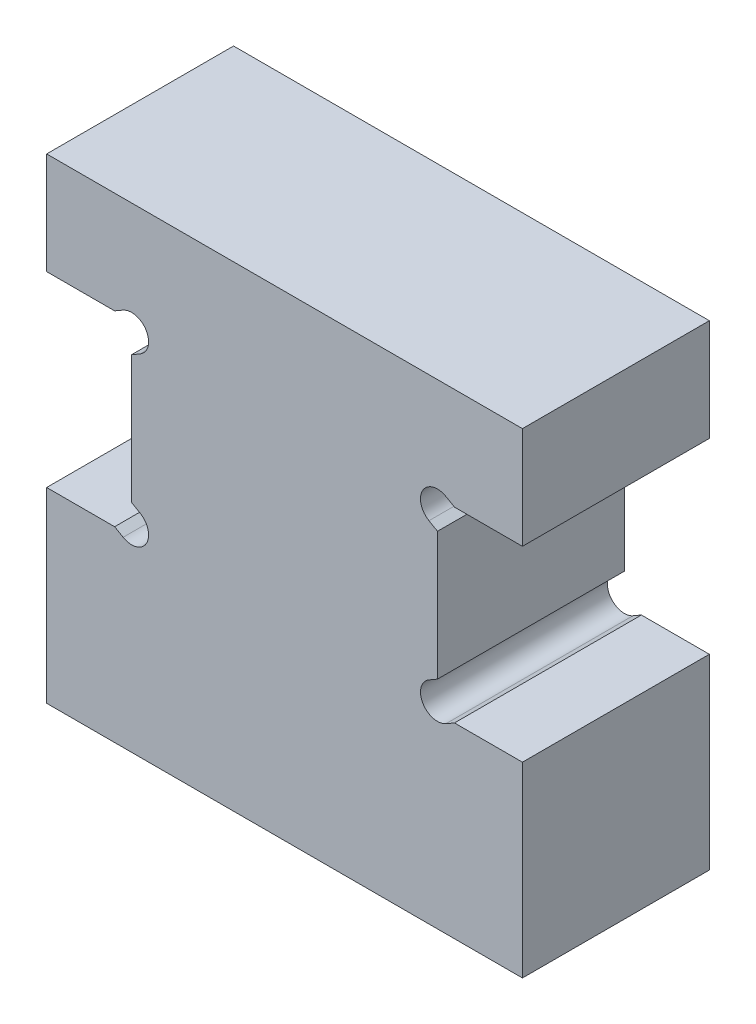
ISO-10303-21;
HEADER;
FILE_DESCRIPTION(('STEP AP214'),'2;1');
FILE_NAME('part.step','',(''),(''),'','','');
FILE_SCHEMA(('AUTOMOTIVE_DESIGN { 1 0 10303 214 1 1 1 1 }'));
ENDSEC;
DATA;
#1=APPLICATION_CONTEXT('core data for automotive mechanical design processes');
#2=APPLICATION_PROTOCOL_DEFINITION('international standard','automotive_design',2000,#1);
#3=PRODUCT_CONTEXT('',#1,'mechanical');
#4=PRODUCT('Part','Part','',(#3));
#5=PRODUCT_RELATED_PRODUCT_CATEGORY('part','',(#4));
#6=PRODUCT_DEFINITION_FORMATION('','',#4);
#7=PRODUCT_DEFINITION_CONTEXT('part definition',#1,'design');
#8=PRODUCT_DEFINITION('design','',#6,#7);
#9=PRODUCT_DEFINITION_SHAPE('','',#8);
#10=(LENGTH_UNIT() NAMED_UNIT(*) SI_UNIT(.MILLI.,.METRE.));
#11=(NAMED_UNIT(*) PLANE_ANGLE_UNIT() SI_UNIT($,.RADIAN.));
#12=(NAMED_UNIT(*) SI_UNIT($,.STERADIAN.) SOLID_ANGLE_UNIT());
#13=UNCERTAINTY_MEASURE_WITH_UNIT(LENGTH_MEASURE(1.E-05),#10,'distance_accuracy_value','');
#14=(GEOMETRIC_REPRESENTATION_CONTEXT(3) GLOBAL_UNCERTAINTY_ASSIGNED_CONTEXT((#13)) GLOBAL_UNIT_ASSIGNED_CONTEXT((#10,
#11,#12)) REPRESENTATION_CONTEXT('',''));
#15=CARTESIAN_POINT('',(0.,0.,0.));
#16=DIRECTION('',(0.,0.,1.));
#17=DIRECTION('',(1.,0.,0.));
#18=AXIS2_PLACEMENT_3D('',#15,#16,#17);
#19=CARTESIAN_POINT('',(-14.,-15.9396745501499,11.));
#20=DIRECTION('',(1.,0.,0.));
#21=DIRECTION('',(0.,0.,-1.));
#22=AXIS2_PLACEMENT_3D('',#19,#20,#21);
#23=PLANE('',#22);
#24=DIRECTION('',(0.,-1.,0.));
#25=VECTOR('',#24,1.);
#26=CARTESIAN_POINT('',(-14.,-15.9396745501499,0.));
#27=LINE('',#26,#25);
#28=CARTESIAN_POINT('',(-14.,-4.93967455014991,0.));
#29=VERTEX_POINT('',#28);
#30=CARTESIAN_POINT('',(-14.,-15.9396745501499,0.));
#31=VERTEX_POINT('',#30);
#32=EDGE_CURVE('E921',#29,#31,#27,.T.);
#33=ORIENTED_EDGE('',*,*,#32,.T.);
#34=DIRECTION('',(0.,0.,-1.));
#35=VECTOR('',#34,1.);
#36=CARTESIAN_POINT('',(-14.,-15.9396745501499,11.));
#37=LINE('',#36,#35);
#38=CARTESIAN_POINT('',(-14.,-15.9396745501499,11.));
#39=VERTEX_POINT('',#38);
#40=EDGE_CURVE('E12',#39,#31,#37,.T.);
#41=ORIENTED_EDGE('',*,*,#40,.F.);
#42=DIRECTION('',(0.,-1.,0.));
#43=VECTOR('',#42,1.);
#44=CARTESIAN_POINT('',(-14.,-15.9396745501499,11.));
#45=LINE('',#44,#43);
#46=CARTESIAN_POINT('',(-14.,-4.93967455014991,11.));
#47=VERTEX_POINT('',#46);
#48=EDGE_CURVE('E995',#47,#39,#45,.T.);
#49=ORIENTED_EDGE('',*,*,#48,.F.);
#50=DIRECTION('',(0.,0.,-1.));
#51=VECTOR('',#50,1.);
#52=CARTESIAN_POINT('',(-14.,-4.93967455014991,11.));
#53=LINE('',#52,#51);
#54=EDGE_CURVE('E920',#47,#29,#53,.T.);
#55=ORIENTED_EDGE('',*,*,#54,.T.);
#56=EDGE_LOOP('',(#33,#41,#49,#55));
#57=FACE_BOUND('',#56,.T.);
#58=ADVANCED_FACE('F718',(#57),#23,.F.);
#59=CARTESIAN_POINT('',(14.,-15.9396745501499,11.));
#60=DIRECTION('',(0.,1.,0.));
#61=DIRECTION('',(0.,0.,1.));
#62=AXIS2_PLACEMENT_3D('',#59,#60,#61);
#63=PLANE('',#62);
#64=CARTESIAN_POINT('',(0.,-15.9396745501499,5.5));
#65=DIRECTION('',(0.,-1.,0.));
#66=DIRECTION('',(0.,0.,-1.));
#67=AXIS2_PLACEMENT_3D('',#64,#65,#66);
#68=CIRCLE('',#67,2.09999999999999);
#69=CARTESIAN_POINT('',(0.,-15.9396745501499,3.40000000000001));
#70=VERTEX_POINT('',#69);
#71=EDGE_CURVE('E1246',#70,#70,#68,.T.);
#72=ORIENTED_EDGE('',*,*,#71,.F.);
#73=EDGE_LOOP('',(#72));
#74=FACE_BOUND('',#73,.T.);
#75=DIRECTION('',(1.,0.,0.));
#76=VECTOR('',#75,1.);
#77=CARTESIAN_POINT('',(14.,-15.9396745501499,0.));
#78=LINE('',#77,#76);
#79=CARTESIAN_POINT('',(14.,-15.9396745501499,0.));
#80=VERTEX_POINT('',#79);
#81=EDGE_CURVE('E924',#31,#80,#78,.T.);
#82=ORIENTED_EDGE('',*,*,#81,.T.);
#83=DIRECTION('',(0.,0.,-1.));
#84=VECTOR('',#83,1.);
#85=CARTESIAN_POINT('',(14.,-15.9396745501499,11.));
#86=LINE('',#85,#84);
#87=CARTESIAN_POINT('',(14.,-15.9396745501499,11.));
#88=VERTEX_POINT('',#87);
#89=EDGE_CURVE('E728',#88,#80,#86,.T.);
#90=ORIENTED_EDGE('',*,*,#89,.F.);
#91=DIRECTION('',(1.,0.,0.));
#92=VECTOR('',#91,1.);
#93=CARTESIAN_POINT('',(14.,-15.9396745501499,11.));
#94=LINE('',#93,#92);
#95=EDGE_CURVE('E826',#39,#88,#94,.T.);
#96=ORIENTED_EDGE('',*,*,#95,.F.);
#97=ORIENTED_EDGE('',*,*,#40,.T.);
#98=EDGE_LOOP('',(#82,#90,#96,#97));
#99=FACE_BOUND('',#98,.T.);
#100=ADVANCED_FACE('F1310',(#74,#99),#63,.F.);
#101=CARTESIAN_POINT('',(14.,-15.9396745501499,11.));
#102=DIRECTION('',(-1.,0.,0.));
#103=DIRECTION('',(0.,0.,1.));
#104=AXIS2_PLACEMENT_3D('',#101,#102,#103);
#105=PLANE('',#104);
#106=DIRECTION('',(0.,1.,0.));
#107=VECTOR('',#106,1.);
#108=CARTESIAN_POINT('',(14.,-15.9396745501499,0.));
#109=LINE('',#108,#107);
#110=CARTESIAN_POINT('',(14.,-4.93967455014991,0.));
#111=VERTEX_POINT('',#110);
#112=EDGE_CURVE('E927',#80,#111,#109,.T.);
#113=ORIENTED_EDGE('',*,*,#112,.T.);
#114=DIRECTION('',(0.,0.,-1.));
#115=VECTOR('',#114,1.);
#116=CARTESIAN_POINT('',(14.,-4.93967455014991,11.));
#117=LINE('',#116,#115);
#118=CARTESIAN_POINT('',(14.,-4.93967455014991,11.));
#119=VERTEX_POINT('',#118);
#120=EDGE_CURVE('E1070',#119,#111,#117,.T.);
#121=ORIENTED_EDGE('',*,*,#120,.F.);
#122=DIRECTION('',(0.,1.,0.));
#123=VECTOR('',#122,1.);
#124=CARTESIAN_POINT('',(14.,-15.9396745501499,11.));
#125=LINE('',#124,#123);
#126=EDGE_CURVE('E1080',#88,#119,#125,.T.);
#127=ORIENTED_EDGE('',*,*,#126,.F.);
#128=ORIENTED_EDGE('',*,*,#89,.T.);
#129=EDGE_LOOP('',(#113,#121,#127,#128));
#130=FACE_BOUND('',#129,.T.);
#131=ADVANCED_FACE('F1077',(#130),#105,.F.);
#132=CARTESIAN_POINT('',(14.,-4.93967455014991,11.));
#133=DIRECTION('',(0.,-1.,0.));
#134=DIRECTION('',(1.,0.,0.));
#135=AXIS2_PLACEMENT_3D('',#132,#133,#134);
#136=PLANE('',#135);
#137=DIRECTION('',(-1.,0.,0.));
#138=VECTOR('',#137,1.);
#139=CARTESIAN_POINT('',(14.,-4.93967455014991,0.));
#140=LINE('',#139,#138);
#141=CARTESIAN_POINT('',(10.,-4.93967455014991,0.));
#142=VERTEX_POINT('',#141);
#143=EDGE_CURVE('E935',#111,#142,#140,.T.);
#144=ORIENTED_EDGE('',*,*,#143,.T.);
#145=DIRECTION('',(0.,0.,-1.));
#146=VECTOR('',#145,1.);
#147=CARTESIAN_POINT('',(10.,-4.93967455014991,11.));
#148=LINE('',#147,#146);
#149=CARTESIAN_POINT('',(10.,-4.93967455014991,11.));
#150=VERTEX_POINT('',#149);
#151=EDGE_CURVE('E1061',#150,#142,#148,.T.);
#152=ORIENTED_EDGE('',*,*,#151,.F.);
#153=DIRECTION('',(-1.,0.,0.));
#154=VECTOR('',#153,1.);
#155=CARTESIAN_POINT('',(14.,-4.93967455014991,11.));
#156=LINE('',#155,#154);
#157=EDGE_CURVE('E1097',#119,#150,#156,.T.);
#158=ORIENTED_EDGE('',*,*,#157,.F.);
#159=ORIENTED_EDGE('',*,*,#120,.T.);
#160=EDGE_LOOP('',(#144,#152,#158,#159));
#161=FACE_BOUND('',#160,.T.);
#162=ADVANCED_FACE('F1088',(#161),#136,.F.);
#163=CARTESIAN_POINT('',(10.,-4.93967455014991,11.));
#164=DIRECTION('',(0.499999999999997,-0.86602540378444,0.));
#165=DIRECTION('',(0.86602540378444,0.499999999999997,0.));
#166=AXIS2_PLACEMENT_3D('',#163,#164,#165);
#167=PLANE('',#166);
#168=DIRECTION('',(-0.86602540378444,-0.499999999999997,0.));
#169=VECTOR('',#168,1.);
#170=CARTESIAN_POINT('',(10.,-4.93967455014991,0.));
#171=LINE('',#170,#169);
#172=CARTESIAN_POINT('',(9.49999999999999,-5.22834968474472,0.));
#173=VERTEX_POINT('',#172);
#174=EDGE_CURVE('E934',#142,#173,#171,.T.);
#175=ORIENTED_EDGE('',*,*,#174,.T.);
#176=DIRECTION('',(0.,0.,-1.));
#177=VECTOR('',#176,1.);
#178=CARTESIAN_POINT('',(9.49999999999999,-5.22834968474472,11.));
#179=LINE('',#178,#177);
#180=CARTESIAN_POINT('',(9.49999999999999,-5.22834968474472,11.));
#181=VERTEX_POINT('',#180);
#182=EDGE_CURVE('E1058',#181,#173,#179,.T.);
#183=ORIENTED_EDGE('',*,*,#182,.F.);
#184=DIRECTION('',(-0.86602540378444,-0.499999999999997,0.));
#185=VECTOR('',#184,1.);
#186=CARTESIAN_POINT('',(10.,-4.93967455014991,11.));
#187=LINE('',#186,#185);
#188=EDGE_CURVE('E1092',#150,#181,#187,.T.);
#189=ORIENTED_EDGE('',*,*,#188,.F.);
#190=ORIENTED_EDGE('',*,*,#151,.T.);
#191=EDGE_LOOP('',(#175,#183,#189,#190));
#192=FACE_BOUND('',#191,.T.);
#193=ADVANCED_FACE('F1095',(#192),#167,.F.);
#194=CARTESIAN_POINT('',(9.,-4.36232428096028,11.));
#195=DIRECTION('',(0.,0.,-1.));
#196=DIRECTION('',(-1.,0.,0.));
#197=AXIS2_PLACEMENT_3D('',#194,#195,#196);
#198=CYLINDRICAL_SURFACE('',#197,1.);
#199=CARTESIAN_POINT('',(9.,-4.36232428096028,0.));
#200=DIRECTION('',(0.,0.,-1.));
#201=DIRECTION('',(-1.,0.,0.));
#202=AXIS2_PLACEMENT_3D('',#199,#200,#201);
#203=CIRCLE('',#202,1.);
#204=CARTESIAN_POINT('',(8.49999999999999,-3.49629887717584,0.));
#205=VERTEX_POINT('',#204);
#206=EDGE_CURVE('E939',#173,#205,#203,.T.);
#207=ORIENTED_EDGE('',*,*,#206,.T.);
#208=DIRECTION('',(0.,0.,-1.));
#209=VECTOR('',#208,1.);
#210=CARTESIAN_POINT('',(8.49999999999999,-3.49629887717584,11.));
#211=LINE('',#210,#209);
#212=CARTESIAN_POINT('',(8.49999999999999,-3.49629887717584,11.));
#213=VERTEX_POINT('',#212);
#214=EDGE_CURVE('E1053',#213,#205,#211,.T.);
#215=ORIENTED_EDGE('',*,*,#214,.F.);
#216=CARTESIAN_POINT('',(9.,-4.36232428096028,11.));
#217=DIRECTION('',(0.,0.,-1.));
#218=DIRECTION('',(-1.,0.,0.));
#219=AXIS2_PLACEMENT_3D('',#216,#217,#218);
#220=CIRCLE('',#219,1.);
#221=EDGE_CURVE('E1100',#181,#213,#220,.T.);
#222=ORIENTED_EDGE('',*,*,#221,.F.);
#223=ORIENTED_EDGE('',*,*,#182,.T.);
#224=EDGE_LOOP('',(#207,#215,#222,#223));
#225=FACE_BOUND('',#224,.T.);
#226=ADVANCED_FACE('F1390',(#225),#198,.F.);
#227=CARTESIAN_POINT('',(8.49999999999999,-3.49629887717584,11.));
#228=DIRECTION('',(-0.499999999999999,0.866025403784439,0.));
#229=DIRECTION('',(-0.866025403784439,-0.499999999999999,0.));
#230=AXIS2_PLACEMENT_3D('',#227,#228,#229);
#231=PLANE('',#230);
#232=DIRECTION('',(0.866025403784439,0.499999999999999,0.));
#233=VECTOR('',#232,1.);
#234=CARTESIAN_POINT('',(8.49999999999999,-3.49629887717584,0.));
#235=LINE('',#234,#233);
#236=CARTESIAN_POINT('',(8.99999999999999,-3.20762374258103,0.));
#237=VERTEX_POINT('',#236);
#238=EDGE_CURVE('E942',#205,#237,#235,.T.);
#239=ORIENTED_EDGE('',*,*,#238,.T.);
#240=DIRECTION('',(0.,0.,-1.));
#241=VECTOR('',#240,1.);
#242=CARTESIAN_POINT('',(8.99999999999999,-3.20762374258103,11.));
#243=LINE('',#242,#241);
#244=CARTESIAN_POINT('',(8.99999999999999,-3.20762374258103,11.));
#245=VERTEX_POINT('',#244);
#246=EDGE_CURVE('E1052',#245,#237,#243,.T.);
#247=ORIENTED_EDGE('',*,*,#246,.F.);
#248=DIRECTION('',(0.866025403784439,0.499999999999999,0.));
#249=VECTOR('',#248,1.);
#250=CARTESIAN_POINT('',(8.49999999999999,-3.49629887717584,11.));
#251=LINE('',#250,#249);
#252=EDGE_CURVE('E1101',#213,#245,#251,.T.);
#253=ORIENTED_EDGE('',*,*,#252,.F.);
#254=ORIENTED_EDGE('',*,*,#214,.T.);
#255=EDGE_LOOP('',(#239,#247,#253,#254));
#256=FACE_BOUND('',#255,.T.);
#257=ADVANCED_FACE('F1381',(#256),#231,.F.);
#258=CARTESIAN_POINT('',(8.99999999999999,-3.20762374258103,11.));
#259=DIRECTION('',(-1.,0.,0.));
#260=DIRECTION('',(0.,0.,1.));
#261=AXIS2_PLACEMENT_3D('',#258,#259,#260);
#262=PLANE('',#261);
#263=DIRECTION('',(0.,1.,0.));
#264=VECTOR('',#263,1.);
#265=CARTESIAN_POINT('',(8.99999999999999,-3.20762374258103,0.));
#266=LINE('',#265,#264);
#267=CARTESIAN_POINT('',(8.99999999999999,4.32827464228122,0.));
#268=VERTEX_POINT('',#267);
#269=EDGE_CURVE('E941',#237,#268,#266,.T.);
#270=ORIENTED_EDGE('',*,*,#269,.T.);
#271=DIRECTION('',(0.,0.,-1.));
#272=VECTOR('',#271,1.);
#273=CARTESIAN_POINT('',(8.99999999999999,4.32827464228122,11.));
#274=LINE('',#273,#272);
#275=CARTESIAN_POINT('',(8.99999999999999,4.32827464228122,11.));
#276=VERTEX_POINT('',#275);
#277=EDGE_CURVE('E1050',#276,#268,#274,.T.);
#278=ORIENTED_EDGE('',*,*,#277,.F.);
#279=DIRECTION('',(0.,1.,0.));
#280=VECTOR('',#279,1.);
#281=CARTESIAN_POINT('',(8.99999999999999,-3.20762374258103,11.));
#282=LINE('',#281,#280);
#283=EDGE_CURVE('E1111',#245,#276,#282,.T.);
#284=ORIENTED_EDGE('',*,*,#283,.F.);
#285=ORIENTED_EDGE('',*,*,#246,.T.);
#286=EDGE_LOOP('',(#270,#278,#284,#285));
#287=FACE_BOUND('',#286,.T.);
#288=ADVANCED_FACE('F1378',(#287),#262,.F.);
#289=CARTESIAN_POINT('',(8.49999999999999,4.61694977687603,11.));
#290=DIRECTION('',(-0.500000000000001,-0.866025403784438,0.));
#291=DIRECTION('',(0.866025403784438,-0.500000000000001,0.));
#292=AXIS2_PLACEMENT_3D('',#289,#290,#291);
#293=PLANE('',#292);
#294=DIRECTION('',(-0.866025403784438,0.500000000000001,0.));
#295=VECTOR('',#294,1.);
#296=CARTESIAN_POINT('',(8.49999999999999,4.61694977687603,0.));
#297=LINE('',#296,#295);
#298=CARTESIAN_POINT('',(8.49999999999999,4.61694977687603,0.));
#299=VERTEX_POINT('',#298);
#300=EDGE_CURVE('E950',#268,#299,#297,.T.);
#301=ORIENTED_EDGE('',*,*,#300,.T.);
#302=DIRECTION('',(0.,0.,-1.));
#303=VECTOR('',#302,1.);
#304=CARTESIAN_POINT('',(8.49999999999999,4.61694977687603,11.));
#305=LINE('',#304,#303);
#306=CARTESIAN_POINT('',(8.49999999999999,4.61694977687603,11.));
#307=VERTEX_POINT('',#306);
#308=EDGE_CURVE('E1042',#307,#299,#305,.T.);
#309=ORIENTED_EDGE('',*,*,#308,.F.);
#310=DIRECTION('',(-0.866025403784438,0.500000000000001,0.));
#311=VECTOR('',#310,1.);
#312=CARTESIAN_POINT('',(8.49999999999999,4.61694977687603,11.));
#313=LINE('',#312,#311);
#314=EDGE_CURVE('E1113',#276,#307,#313,.T.);
#315=ORIENTED_EDGE('',*,*,#314,.F.);
#316=ORIENTED_EDGE('',*,*,#277,.T.);
#317=EDGE_LOOP('',(#301,#309,#315,#316));
#318=FACE_BOUND('',#317,.T.);
#319=ADVANCED_FACE('F1374',(#318),#293,.F.);
#320=CARTESIAN_POINT('',(9.,5.48297518066047,11.));
#321=DIRECTION('',(0.,0.,-1.));
#322=DIRECTION('',(-1.,0.,0.));
#323=AXIS2_PLACEMENT_3D('',#320,#321,#322);
#324=CYLINDRICAL_SURFACE('',#323,1.);
#325=CARTESIAN_POINT('',(9.,5.48297518066047,0.));
#326=DIRECTION('',(0.,0.,-1.));
#327=DIRECTION('',(1.,0.,0.));
#328=AXIS2_PLACEMENT_3D('',#325,#326,#327);
#329=CIRCLE('',#328,1.);
#330=CARTESIAN_POINT('',(9.5,6.34900058444491,0.));
#331=VERTEX_POINT('',#330);
#332=EDGE_CURVE('E949',#299,#331,#329,.T.);
#333=ORIENTED_EDGE('',*,*,#332,.T.);
#334=DIRECTION('',(0.,0.,-1.));
#335=VECTOR('',#334,1.);
#336=CARTESIAN_POINT('',(9.5,6.34900058444491,11.));
#337=LINE('',#336,#335);
#338=CARTESIAN_POINT('',(9.5,6.34900058444491,11.));
#339=VERTEX_POINT('',#338);
#340=EDGE_CURVE('E1037',#339,#331,#337,.T.);
#341=ORIENTED_EDGE('',*,*,#340,.F.);
#342=CARTESIAN_POINT('',(9.,5.48297518066047,11.));
#343=DIRECTION('',(0.,0.,-1.));
#344=DIRECTION('',(1.,0.,0.));
#345=AXIS2_PLACEMENT_3D('',#342,#343,#344);
#346=CIRCLE('',#345,1.);
#347=EDGE_CURVE('E1120',#307,#339,#346,.T.);
#348=ORIENTED_EDGE('',*,*,#347,.F.);
#349=ORIENTED_EDGE('',*,*,#308,.T.);
#350=EDGE_LOOP('',(#333,#341,#348,#349));
#351=FACE_BOUND('',#350,.T.);
#352=ADVANCED_FACE('F1367',(#351),#324,.F.);
#353=CARTESIAN_POINT('',(10.,6.0603254498501,11.));
#354=DIRECTION('',(0.499999999999998,0.86602540378444,0.));
#355=DIRECTION('',(-0.86602540378444,0.499999999999998,0.));
#356=AXIS2_PLACEMENT_3D('',#353,#354,#355);
#357=PLANE('',#356);
#358=DIRECTION('',(0.86602540378444,-0.499999999999998,0.));
#359=VECTOR('',#358,1.);
#360=CARTESIAN_POINT('',(10.,6.0603254498501,0.));
#361=LINE('',#360,#359);
#362=CARTESIAN_POINT('',(10.,6.0603254498501,0.));
#363=VERTEX_POINT('',#362);
#364=EDGE_CURVE('E951',#331,#363,#361,.T.);
#365=ORIENTED_EDGE('',*,*,#364,.T.);
#366=DIRECTION('',(0.,0.,-1.));
#367=VECTOR('',#366,1.);
#368=CARTESIAN_POINT('',(10.,6.0603254498501,11.));
#369=LINE('',#368,#367);
#370=CARTESIAN_POINT('',(10.,6.0603254498501,11.));
#371=VERTEX_POINT('',#370);
#372=EDGE_CURVE('E1034',#371,#363,#369,.T.);
#373=ORIENTED_EDGE('',*,*,#372,.F.);
#374=DIRECTION('',(0.86602540378444,-0.499999999999998,0.));
#375=VECTOR('',#374,1.);
#376=CARTESIAN_POINT('',(10.,6.0603254498501,11.));
#377=LINE('',#376,#375);
#378=EDGE_CURVE('E1118',#339,#371,#377,.T.);
#379=ORIENTED_EDGE('',*,*,#378,.F.);
#380=ORIENTED_EDGE('',*,*,#340,.T.);
#381=EDGE_LOOP('',(#365,#373,#379,#380));
#382=FACE_BOUND('',#381,.T.);
#383=ADVANCED_FACE('F1364',(#382),#357,.F.);
#384=CARTESIAN_POINT('',(14.,6.0603254498501,11.));
#385=DIRECTION('',(0.,1.,0.));
#386=DIRECTION('',(-1.,0.,0.));
#387=AXIS2_PLACEMENT_3D('',#384,#385,#386);
#388=PLANE('',#387);
#389=DIRECTION('',(1.,0.,0.));
#390=VECTOR('',#389,1.);
#391=CARTESIAN_POINT('',(14.,6.0603254498501,0.));
#392=LINE('',#391,#390);
#393=CARTESIAN_POINT('',(14.,6.0603254498501,0.));
#394=VERTEX_POINT('',#393);
#395=EDGE_CURVE('E957',#363,#394,#392,.T.);
#396=ORIENTED_EDGE('',*,*,#395,.T.);
#397=DIRECTION('',(0.,0.,-1.));
#398=VECTOR('',#397,1.);
#399=CARTESIAN_POINT('',(14.,6.0603254498501,11.));
#400=LINE('',#399,#398);
#401=CARTESIAN_POINT('',(14.,6.0603254498501,11.));
#402=VERTEX_POINT('',#401);
#403=EDGE_CURVE('E1031',#402,#394,#400,.T.);
#404=ORIENTED_EDGE('',*,*,#403,.F.);
#405=DIRECTION('',(1.,0.,0.));
#406=VECTOR('',#405,1.);
#407=CARTESIAN_POINT('',(14.,6.0603254498501,11.));
#408=LINE('',#407,#406);
#409=EDGE_CURVE('E1124',#371,#402,#408,.T.);
#410=ORIENTED_EDGE('',*,*,#409,.F.);
#411=ORIENTED_EDGE('',*,*,#372,.T.);
#412=EDGE_LOOP('',(#396,#404,#410,#411));
#413=FACE_BOUND('',#412,.T.);
#414=ADVANCED_FACE('F1357',(#413),#388,.F.);
#415=CARTESIAN_POINT('',(14.,6.0603254498501,11.));
#416=DIRECTION('',(-1.,0.,0.));
#417=DIRECTION('',(0.,0.,1.));
#418=AXIS2_PLACEMENT_3D('',#415,#416,#417);
#419=PLANE('',#418);
#420=DIRECTION('',(0.,1.,0.));
#421=VECTOR('',#420,1.);
#422=CARTESIAN_POINT('',(14.,6.0603254498501,0.));
#423=LINE('',#422,#421);
#424=CARTESIAN_POINT('',(14.,12.0603254498501,0.));
#425=VERTEX_POINT('',#424);
#426=EDGE_CURVE('E956',#394,#425,#423,.T.);
#427=ORIENTED_EDGE('',*,*,#426,.T.);
#428=DIRECTION('',(0.,0.,-1.));
#429=VECTOR('',#428,1.);
#430=CARTESIAN_POINT('',(14.,12.0603254498501,11.));
#431=LINE('',#430,#429);
#432=CARTESIAN_POINT('',(14.,12.0603254498501,11.));
#433=VERTEX_POINT('',#432);
#434=EDGE_CURVE('E1030',#433,#425,#431,.T.);
#435=ORIENTED_EDGE('',*,*,#434,.F.);
#436=DIRECTION('',(0.,1.,0.));
#437=VECTOR('',#436,1.);
#438=CARTESIAN_POINT('',(14.,6.0603254498501,11.));
#439=LINE('',#438,#437);
#440=EDGE_CURVE('E1126',#402,#433,#439,.T.);
#441=ORIENTED_EDGE('',*,*,#440,.F.);
#442=ORIENTED_EDGE('',*,*,#403,.T.);
#443=EDGE_LOOP('',(#427,#435,#441,#442));
#444=FACE_BOUND('',#443,.T.);
#445=ADVANCED_FACE('F1355',(#444),#419,.F.);
#446=CARTESIAN_POINT('',(-14.,12.0603254498501,11.));
#447=DIRECTION('',(0.,-1.,0.));
#448=DIRECTION('',(0.,0.,-1.));
#449=AXIS2_PLACEMENT_3D('',#446,#447,#448);
#450=PLANE('',#449);
#451=DIRECTION('',(-1.,0.,0.));
#452=VECTOR('',#451,1.);
#453=CARTESIAN_POINT('',(-14.,12.0603254498501,0.));
#454=LINE('',#453,#452);
#455=CARTESIAN_POINT('',(-14.,12.0603254498501,0.));
#456=VERTEX_POINT('',#455);
#457=EDGE_CURVE('E965',#425,#456,#454,.T.);
#458=ORIENTED_EDGE('',*,*,#457,.T.);
#459=DIRECTION('',(0.,0.,-1.));
#460=VECTOR('',#459,1.);
#461=CARTESIAN_POINT('',(-14.,12.0603254498501,11.));
#462=LINE('',#461,#460);
#463=CARTESIAN_POINT('',(-14.,12.0603254498501,11.));
#464=VERTEX_POINT('',#463);
#465=EDGE_CURVE('E1021',#464,#456,#462,.T.);
#466=ORIENTED_EDGE('',*,*,#465,.F.);
#467=DIRECTION('',(-1.,0.,0.));
#468=VECTOR('',#467,1.);
#469=CARTESIAN_POINT('',(-14.,12.0603254498501,11.));
#470=LINE('',#469,#468);
#471=EDGE_CURVE('E1128',#433,#464,#470,.T.);
#472=ORIENTED_EDGE('',*,*,#471,.F.);
#473=ORIENTED_EDGE('',*,*,#434,.T.);
#474=EDGE_LOOP('',(#458,#466,#472,#473));
#475=FACE_BOUND('',#474,.T.);
#476=ADVANCED_FACE('F1349',(#475),#450,.F.);
#477=CARTESIAN_POINT('',(-14.,6.0603254498501,11.));
#478=DIRECTION('',(1.,0.,0.));
#479=DIRECTION('',(0.,0.,-1.));
#480=AXIS2_PLACEMENT_3D('',#477,#478,#479);
#481=PLANE('',#480);
#482=DIRECTION('',(0.,-1.,0.));
#483=VECTOR('',#482,1.);
#484=CARTESIAN_POINT('',(-14.,6.0603254498501,0.));
#485=LINE('',#484,#483);
#486=CARTESIAN_POINT('',(-14.,6.0603254498501,0.));
#487=VERTEX_POINT('',#486);
#488=EDGE_CURVE('E964',#456,#487,#485,.T.);
#489=ORIENTED_EDGE('',*,*,#488,.T.);
#490=DIRECTION('',(0.,0.,-1.));
#491=VECTOR('',#490,1.);
#492=CARTESIAN_POINT('',(-14.,6.0603254498501,11.));
#493=LINE('',#492,#491);
#494=CARTESIAN_POINT('',(-14.,6.0603254498501,11.));
#495=VERTEX_POINT('',#494);
#496=EDGE_CURVE('E1018',#495,#487,#493,.T.);
#497=ORIENTED_EDGE('',*,*,#496,.F.);
#498=DIRECTION('',(0.,-1.,0.));
#499=VECTOR('',#498,1.);
#500=CARTESIAN_POINT('',(-14.,6.0603254498501,11.));
#501=LINE('',#500,#499);
#502=EDGE_CURVE('E1132',#464,#495,#501,.T.);
#503=ORIENTED_EDGE('',*,*,#502,.F.);
#504=ORIENTED_EDGE('',*,*,#465,.T.);
#505=EDGE_LOOP('',(#489,#497,#503,#504));
#506=FACE_BOUND('',#505,.T.);
#507=ADVANCED_FACE('F1343',(#506),#481,.F.);
#508=CARTESIAN_POINT('',(-14.,6.0603254498501,11.));
#509=DIRECTION('',(0.,1.,0.));
#510=DIRECTION('',(-1.,0.,0.));
#511=AXIS2_PLACEMENT_3D('',#508,#509,#510);
#512=PLANE('',#511);
#513=DIRECTION('',(1.,0.,0.));
#514=VECTOR('',#513,1.);
#515=CARTESIAN_POINT('',(-14.,6.0603254498501,0.));
#516=LINE('',#515,#514);
#517=CARTESIAN_POINT('',(-10.,6.0603254498501,0.));
#518=VERTEX_POINT('',#517);
#519=EDGE_CURVE('E966',#487,#518,#516,.T.);
#520=ORIENTED_EDGE('',*,*,#519,.T.);
#521=DIRECTION('',(0.,0.,-1.));
#522=VECTOR('',#521,1.);
#523=CARTESIAN_POINT('',(-10.,6.0603254498501,11.));
#524=LINE('',#523,#522);
#525=CARTESIAN_POINT('',(-10.,6.0603254498501,11.));
#526=VERTEX_POINT('',#525);
#527=EDGE_CURVE('E1013',#526,#518,#524,.T.);
#528=ORIENTED_EDGE('',*,*,#527,.F.);
#529=DIRECTION('',(1.,0.,0.));
#530=VECTOR('',#529,1.);
#531=CARTESIAN_POINT('',(-14.,6.0603254498501,11.));
#532=LINE('',#531,#530);
#533=EDGE_CURVE('E1134',#495,#526,#532,.T.);
#534=ORIENTED_EDGE('',*,*,#533,.F.);
#535=ORIENTED_EDGE('',*,*,#496,.T.);
#536=EDGE_LOOP('',(#520,#528,#534,#535));
#537=FACE_BOUND('',#536,.T.);
#538=ADVANCED_FACE('F1339',(#537),#512,.F.);
#539=CARTESIAN_POINT('',(-10.,6.0603254498501,11.));
#540=DIRECTION('',(-0.499999999999998,0.86602540378444,0.));
#541=DIRECTION('',(-0.86602540378444,-0.499999999999998,0.));
#542=AXIS2_PLACEMENT_3D('',#539,#540,#541);
#543=PLANE('',#542);
#544=DIRECTION('',(0.86602540378444,0.499999999999998,0.));
#545=VECTOR('',#544,1.);
#546=CARTESIAN_POINT('',(-10.,6.0603254498501,0.));
#547=LINE('',#546,#545);
#548=CARTESIAN_POINT('',(-9.5,6.34900058444491,0.));
#549=VERTEX_POINT('',#548);
#550=EDGE_CURVE('E973',#518,#549,#547,.T.);
#551=ORIENTED_EDGE('',*,*,#550,.T.);
#552=DIRECTION('',(0.,0.,-1.));
#553=VECTOR('',#552,1.);
#554=CARTESIAN_POINT('',(-9.5,6.34900058444491,11.));
#555=LINE('',#554,#553);
#556=CARTESIAN_POINT('',(-9.5,6.34900058444491,11.));
#557=VERTEX_POINT('',#556);
#558=EDGE_CURVE('E1012',#557,#549,#555,.T.);
#559=ORIENTED_EDGE('',*,*,#558,.F.);
#560=DIRECTION('',(0.86602540378444,0.499999999999998,0.));
#561=VECTOR('',#560,1.);
#562=CARTESIAN_POINT('',(-10.,6.0603254498501,11.));
#563=LINE('',#562,#561);
#564=EDGE_CURVE('E1136',#526,#557,#563,.T.);
#565=ORIENTED_EDGE('',*,*,#564,.F.);
#566=ORIENTED_EDGE('',*,*,#527,.T.);
#567=EDGE_LOOP('',(#551,#559,#565,#566));
#568=FACE_BOUND('',#567,.T.);
#569=ADVANCED_FACE('F1334',(#568),#543,.F.);
#570=CARTESIAN_POINT('',(-9.,5.48297518066047,11.));
#571=DIRECTION('',(0.,0.,-1.));
#572=DIRECTION('',(-1.,0.,0.));
#573=AXIS2_PLACEMENT_3D('',#570,#571,#572);
#574=CYLINDRICAL_SURFACE('',#573,1.);
#575=CARTESIAN_POINT('',(-9.,5.48297518066047,0.));
#576=DIRECTION('',(0.,0.,-1.));
#577=DIRECTION('',(-1.,0.,0.));
#578=AXIS2_PLACEMENT_3D('',#575,#576,#577);
#579=CIRCLE('',#578,1.);
#580=CARTESIAN_POINT('',(-8.49999999999999,4.61694977687603,0.));
#581=VERTEX_POINT('',#580);
#582=EDGE_CURVE('E974',#549,#581,#579,.T.);
#583=ORIENTED_EDGE('',*,*,#582,.T.);
#584=DIRECTION('',(0.,0.,-1.));
#585=VECTOR('',#584,1.);
#586=CARTESIAN_POINT('',(-8.49999999999999,4.61694977687603,11.));
#587=LINE('',#586,#585);
#588=CARTESIAN_POINT('',(-8.49999999999999,4.61694977687603,11.));
#589=VERTEX_POINT('',#588);
#590=EDGE_CURVE('E1010',#589,#581,#587,.T.);
#591=ORIENTED_EDGE('',*,*,#590,.F.);
#592=CARTESIAN_POINT('',(-9.,5.48297518066047,11.));
#593=DIRECTION('',(0.,0.,-1.));
#594=DIRECTION('',(-1.,0.,0.));
#595=AXIS2_PLACEMENT_3D('',#592,#593,#594);
#596=CIRCLE('',#595,1.);
#597=EDGE_CURVE('E1141',#557,#589,#596,.T.);
#598=ORIENTED_EDGE('',*,*,#597,.F.);
#599=ORIENTED_EDGE('',*,*,#558,.T.);
#600=EDGE_LOOP('',(#583,#591,#598,#599));
#601=FACE_BOUND('',#600,.T.);
#602=ADVANCED_FACE('F1328',(#601),#574,.F.);
#603=CARTESIAN_POINT('',(-8.49999999999999,4.61694977687603,11.));
#604=DIRECTION('',(0.500000000000001,-0.866025403784438,0.));
#605=DIRECTION('',(0.866025403784438,0.500000000000001,0.));
#606=AXIS2_PLACEMENT_3D('',#603,#604,#605);
#607=PLANE('',#606);
#608=DIRECTION('',(-0.866025403784438,-0.500000000000001,0.));
#609=VECTOR('',#608,1.);
#610=CARTESIAN_POINT('',(-8.49999999999999,4.61694977687603,0.));
#611=LINE('',#610,#609);
#612=CARTESIAN_POINT('',(-8.99999999999999,4.32827464228122,0.));
#613=VERTEX_POINT('',#612);
#614=EDGE_CURVE('E980',#581,#613,#611,.T.);
#615=ORIENTED_EDGE('',*,*,#614,.T.);
#616=DIRECTION('',(0.,0.,-1.));
#617=VECTOR('',#616,1.);
#618=CARTESIAN_POINT('',(-8.99999999999999,4.32827464228122,11.));
#619=LINE('',#618,#617);
#620=CARTESIAN_POINT('',(-8.99999999999999,4.32827464228122,11.));
#621=VERTEX_POINT('',#620);
#622=EDGE_CURVE('E1002',#621,#613,#619,.T.);
#623=ORIENTED_EDGE('',*,*,#622,.F.);
#624=DIRECTION('',(-0.866025403784438,-0.500000000000001,0.));
#625=VECTOR('',#624,1.);
#626=CARTESIAN_POINT('',(-8.49999999999999,4.61694977687603,11.));
#627=LINE('',#626,#625);
#628=EDGE_CURVE('E1142',#589,#621,#627,.T.);
#629=ORIENTED_EDGE('',*,*,#628,.F.);
#630=ORIENTED_EDGE('',*,*,#590,.T.);
#631=EDGE_LOOP('',(#615,#623,#629,#630));
#632=FACE_BOUND('',#631,.T.);
#633=ADVANCED_FACE('F1321',(#632),#607,.F.);
#634=CARTESIAN_POINT('',(-8.99999999999999,-3.20762374258103,11.));
#635=DIRECTION('',(1.,0.,0.));
#636=DIRECTION('',(0.,0.,-1.));
#637=AXIS2_PLACEMENT_3D('',#634,#635,#636);
#638=PLANE('',#637);
#639=DIRECTION('',(0.,-1.,0.));
#640=VECTOR('',#639,1.);
#641=CARTESIAN_POINT('',(-8.99999999999999,-3.20762374258103,0.));
#642=LINE('',#641,#640);
#643=CARTESIAN_POINT('',(-8.99999999999999,-3.20762374258103,0.));
#644=VERTEX_POINT('',#643);
#645=EDGE_CURVE('E979',#613,#644,#642,.T.);
#646=ORIENTED_EDGE('',*,*,#645,.T.);
#647=DIRECTION('',(0.,0.,-1.));
#648=VECTOR('',#647,1.);
#649=CARTESIAN_POINT('',(-8.99999999999999,-3.20762374258103,11.));
#650=LINE('',#649,#648);
#651=CARTESIAN_POINT('',(-8.99999999999999,-3.20762374258103,11.));
#652=VERTEX_POINT('',#651);
#653=EDGE_CURVE('E996',#652,#644,#650,.T.);
#654=ORIENTED_EDGE('',*,*,#653,.F.);
#655=DIRECTION('',(0.,-1.,0.));
#656=VECTOR('',#655,1.);
#657=CARTESIAN_POINT('',(-8.99999999999999,-3.20762374258103,11.));
#658=LINE('',#657,#656);
#659=EDGE_CURVE('E1150',#621,#652,#658,.T.);
#660=ORIENTED_EDGE('',*,*,#659,.F.);
#661=ORIENTED_EDGE('',*,*,#622,.T.);
#662=EDGE_LOOP('',(#646,#654,#660,#661));
#663=FACE_BOUND('',#662,.T.);
#664=ADVANCED_FACE('F1319',(#663),#638,.F.);
#665=CARTESIAN_POINT('',(-8.49999999999999,-3.49629887717584,11.));
#666=DIRECTION('',(0.499999999999999,0.866025403784439,0.));
#667=DIRECTION('',(-0.866025403784439,0.499999999999999,0.));
#668=AXIS2_PLACEMENT_3D('',#665,#666,#667);
#669=PLANE('',#668);
#670=DIRECTION('',(0.866025403784439,-0.499999999999999,0.));
#671=VECTOR('',#670,1.);
#672=CARTESIAN_POINT('',(-8.49999999999999,-3.49629887717584,0.));
#673=LINE('',#672,#671);
#674=CARTESIAN_POINT('',(-8.49999999999999,-3.49629887717584,0.));
#675=VERTEX_POINT('',#674);
#676=EDGE_CURVE('E983',#644,#675,#673,.T.);
#677=ORIENTED_EDGE('',*,*,#676,.T.);
#678=DIRECTION('',(0.,0.,-1.));
#679=VECTOR('',#678,1.);
#680=CARTESIAN_POINT('',(-8.49999999999999,-3.49629887717584,11.));
#681=LINE('',#680,#679);
#682=CARTESIAN_POINT('',(-8.49999999999999,-3.49629887717584,11.));
#683=VERTEX_POINT('',#682);
#684=EDGE_CURVE('E907',#683,#675,#681,.T.);
#685=ORIENTED_EDGE('',*,*,#684,.F.);
#686=DIRECTION('',(0.866025403784439,-0.499999999999999,0.));
#687=VECTOR('',#686,1.);
#688=CARTESIAN_POINT('',(-8.49999999999999,-3.49629887717584,11.));
#689=LINE('',#688,#687);
#690=EDGE_CURVE('E900',#652,#683,#689,.T.);
#691=ORIENTED_EDGE('',*,*,#690,.F.);
#692=ORIENTED_EDGE('',*,*,#653,.T.);
#693=EDGE_LOOP('',(#677,#685,#691,#692));
#694=FACE_BOUND('',#693,.T.);
#695=ADVANCED_FACE('F1316',(#694),#669,.F.);
#696=CARTESIAN_POINT('',(-9.,-4.36232428096028,11.));
#697=DIRECTION('',(0.,0.,-1.));
#698=DIRECTION('',(-1.,0.,0.));
#699=AXIS2_PLACEMENT_3D('',#696,#697,#698);
#700=CYLINDRICAL_SURFACE('',#699,1.);
#701=CARTESIAN_POINT('',(-9.,-4.36232428096028,0.));
#702=DIRECTION('',(0.,0.,-1.));
#703=DIRECTION('',(1.,0.,0.));
#704=AXIS2_PLACEMENT_3D('',#701,#702,#703);
#705=CIRCLE('',#704,1.);
#706=CARTESIAN_POINT('',(-9.49999999999999,-5.22834968474472,0.));
#707=VERTEX_POINT('',#706);
#708=EDGE_CURVE('E906',#675,#707,#705,.T.);
#709=ORIENTED_EDGE('',*,*,#708,.T.);
#710=DIRECTION('',(0.,0.,-1.));
#711=VECTOR('',#710,1.);
#712=CARTESIAN_POINT('',(-9.49999999999999,-5.22834968474472,11.));
#713=LINE('',#712,#711);
#714=CARTESIAN_POINT('',(-9.49999999999999,-5.22834968474472,11.));
#715=VERTEX_POINT('',#714);
#716=EDGE_CURVE('E904',#715,#707,#713,.T.);
#717=ORIENTED_EDGE('',*,*,#716,.F.);
#718=CARTESIAN_POINT('',(-9.,-4.36232428096028,11.));
#719=DIRECTION('',(0.,0.,-1.));
#720=DIRECTION('',(1.,0.,0.));
#721=AXIS2_PLACEMENT_3D('',#718,#719,#720);
#722=CIRCLE('',#721,1.);
#723=EDGE_CURVE('E891',#683,#715,#722,.T.);
#724=ORIENTED_EDGE('',*,*,#723,.F.);
#725=ORIENTED_EDGE('',*,*,#684,.T.);
#726=EDGE_LOOP('',(#709,#717,#724,#725));
#727=FACE_BOUND('',#726,.T.);
#728=ADVANCED_FACE('F901',(#727),#700,.F.);
#729=CARTESIAN_POINT('',(-10.,-4.93967455014991,11.));
#730=DIRECTION('',(-0.499999999999997,-0.86602540378444,0.));
#731=DIRECTION('',(0.86602540378444,-0.499999999999997,0.));
#732=AXIS2_PLACEMENT_3D('',#729,#730,#731);
#733=PLANE('',#732);
#734=DIRECTION('',(-0.86602540378444,0.499999999999997,0.));
#735=VECTOR('',#734,1.);
#736=CARTESIAN_POINT('',(-10.,-4.93967455014991,0.));
#737=LINE('',#736,#735);
#738=CARTESIAN_POINT('',(-10.,-4.93967455014991,0.));
#739=VERTEX_POINT('',#738);
#740=EDGE_CURVE('E814',#707,#739,#737,.T.);
#741=ORIENTED_EDGE('',*,*,#740,.T.);
#742=DIRECTION('',(0.,0.,-1.));
#743=VECTOR('',#742,1.);
#744=CARTESIAN_POINT('',(-10.,-4.93967455014991,11.));
#745=LINE('',#744,#743);
#746=CARTESIAN_POINT('',(-10.,-4.93967455014991,11.));
#747=VERTEX_POINT('',#746);
#748=EDGE_CURVE('E908',#747,#739,#745,.T.);
#749=ORIENTED_EDGE('',*,*,#748,.F.);
#750=DIRECTION('',(-0.86602540378444,0.499999999999997,0.));
#751=VECTOR('',#750,1.);
#752=CARTESIAN_POINT('',(-10.,-4.93967455014991,11.));
#753=LINE('',#752,#751);
#754=EDGE_CURVE('E894',#715,#747,#753,.T.);
#755=ORIENTED_EDGE('',*,*,#754,.F.);
#756=ORIENTED_EDGE('',*,*,#716,.T.);
#757=EDGE_LOOP('',(#741,#749,#755,#756));
#758=FACE_BOUND('',#757,.T.);
#759=ADVANCED_FACE('F913',(#758),#733,.F.);
#760=CARTESIAN_POINT('',(-14.,-4.93967455014991,11.));
#761=DIRECTION('',(0.,-1.,0.));
#762=DIRECTION('',(1.,0.,0.));
#763=AXIS2_PLACEMENT_3D('',#760,#761,#762);
#764=PLANE('',#763);
#765=DIRECTION('',(-1.,0.,0.));
#766=VECTOR('',#765,1.);
#767=CARTESIAN_POINT('',(-14.,-4.93967455014991,0.));
#768=LINE('',#767,#766);
#769=EDGE_CURVE('E821',#739,#29,#768,.T.);
#770=ORIENTED_EDGE('',*,*,#769,.T.);
#771=ORIENTED_EDGE('',*,*,#54,.F.);
#772=DIRECTION('',(-1.,0.,0.));
#773=VECTOR('',#772,1.);
#774=CARTESIAN_POINT('',(-14.,-4.93967455014991,11.));
#775=LINE('',#774,#773);
#776=EDGE_CURVE('E740',#747,#47,#775,.T.);
#777=ORIENTED_EDGE('',*,*,#776,.F.);
#778=ORIENTED_EDGE('',*,*,#748,.T.);
#779=EDGE_LOOP('',(#770,#771,#777,#778));
#780=FACE_BOUND('',#779,.T.);
#781=ADVANCED_FACE('F1553',(#780),#764,.F.);
#782=CARTESIAN_POINT('',(-9.,-4.36232428096028,11.));
#783=DIRECTION('',(0.,0.,1.));
#784=DIRECTION('',(1.,0.,0.));
#785=AXIS2_PLACEMENT_3D('',#782,#783,#784);
#786=PLANE('',#785);
#787=ORIENTED_EDGE('',*,*,#48,.T.);
#788=ORIENTED_EDGE('',*,*,#95,.T.);
#789=ORIENTED_EDGE('',*,*,#126,.T.);
#790=ORIENTED_EDGE('',*,*,#157,.T.);
#791=ORIENTED_EDGE('',*,*,#188,.T.);
#792=ORIENTED_EDGE('',*,*,#221,.T.);
#793=ORIENTED_EDGE('',*,*,#252,.T.);
#794=ORIENTED_EDGE('',*,*,#283,.T.);
#795=ORIENTED_EDGE('',*,*,#314,.T.);
#796=ORIENTED_EDGE('',*,*,#347,.T.);
#797=ORIENTED_EDGE('',*,*,#378,.T.);
#798=ORIENTED_EDGE('',*,*,#409,.T.);
#799=ORIENTED_EDGE('',*,*,#440,.T.);
#800=ORIENTED_EDGE('',*,*,#471,.T.);
#801=ORIENTED_EDGE('',*,*,#502,.T.);
#802=ORIENTED_EDGE('',*,*,#533,.T.);
#803=ORIENTED_EDGE('',*,*,#564,.T.);
#804=ORIENTED_EDGE('',*,*,#597,.T.);
#805=ORIENTED_EDGE('',*,*,#628,.T.);
#806=ORIENTED_EDGE('',*,*,#659,.T.);
#807=ORIENTED_EDGE('',*,*,#690,.T.);
#808=ORIENTED_EDGE('',*,*,#723,.T.);
#809=ORIENTED_EDGE('',*,*,#754,.T.);
#810=ORIENTED_EDGE('',*,*,#776,.T.);
#811=EDGE_LOOP('',(#787,#788,#789,#790,#791,#792,#793,#794,#795,#796,#797,#798,#799,#800,#801,
#802,#803,#804,#805,#806,#807,#808,#809,#810));
#812=FACE_BOUND('',#811,.T.);
#813=ADVANCED_FACE('F892',(#812),#786,.T.);
#814=CARTESIAN_POINT('',(-9.,-4.36232428096028,0.));
#815=DIRECTION('',(0.,0.,1.));
#816=DIRECTION('',(1.,0.,0.));
#817=AXIS2_PLACEMENT_3D('',#814,#815,#816);
#818=PLANE('',#817);
#819=ORIENTED_EDGE('',*,*,#32,.F.);
#820=ORIENTED_EDGE('',*,*,#769,.F.);
#821=ORIENTED_EDGE('',*,*,#740,.F.);
#822=ORIENTED_EDGE('',*,*,#708,.F.);
#823=ORIENTED_EDGE('',*,*,#676,.F.);
#824=ORIENTED_EDGE('',*,*,#645,.F.);
#825=ORIENTED_EDGE('',*,*,#614,.F.);
#826=ORIENTED_EDGE('',*,*,#582,.F.);
#827=ORIENTED_EDGE('',*,*,#550,.F.);
#828=ORIENTED_EDGE('',*,*,#519,.F.);
#829=ORIENTED_EDGE('',*,*,#488,.F.);
#830=ORIENTED_EDGE('',*,*,#457,.F.);
#831=ORIENTED_EDGE('',*,*,#426,.F.);
#832=ORIENTED_EDGE('',*,*,#395,.F.);
#833=ORIENTED_EDGE('',*,*,#364,.F.);
#834=ORIENTED_EDGE('',*,*,#332,.F.);
#835=ORIENTED_EDGE('',*,*,#300,.F.);
#836=ORIENTED_EDGE('',*,*,#269,.F.);
#837=ORIENTED_EDGE('',*,*,#238,.F.);
#838=ORIENTED_EDGE('',*,*,#206,.F.);
#839=ORIENTED_EDGE('',*,*,#174,.F.);
#840=ORIENTED_EDGE('',*,*,#143,.F.);
#841=ORIENTED_EDGE('',*,*,#112,.F.);
#842=ORIENTED_EDGE('',*,*,#81,.F.);
#843=EDGE_LOOP('',(#819,#820,#821,#822,#823,#824,#825,#826,#827,#828,#829,#830,#831,#832,#833,
#834,#835,#836,#837,#838,#839,#840,#841,#842));
#844=FACE_BOUND('',#843,.T.);
#845=ADVANCED_FACE('F1081',(#844),#818,.F.);
#846=CARTESIAN_POINT('',(0.,0.798518149892218,5.5));
#847=DIRECTION('',(0.,-1.,0.));
#848=DIRECTION('',(0.,0.,-1.));
#849=AXIS2_PLACEMENT_3D('',#846,#847,#848);
#850=CONICAL_SURFACE('',#849,2.1,1.02974425867665);
#851=CARTESIAN_POINT('',(0.,2.0603254498501,5.5));
#852=VERTEX_POINT('',#851);
#853=VERTEX_LOOP('',#852);
#854=FACE_BOUND('',#853,.T.);
#855=CARTESIAN_POINT('',(0.,0.798518149892218,5.5));
#856=DIRECTION('',(0.,-1.,0.));
#857=DIRECTION('',(0.,0.,-1.));
#858=AXIS2_PLACEMENT_3D('',#855,#856,#857);
#859=CIRCLE('',#858,2.1);
#860=CARTESIAN_POINT('',(0.,0.798518149892218,3.4));
#861=VERTEX_POINT('',#860);
#862=EDGE_CURVE('E926',#861,#861,#859,.T.);
#863=ORIENTED_EDGE('',*,*,#862,.T.);
#864=EDGE_LOOP('',(#863));
#865=FACE_BOUND('',#864,.T.);
#866=ADVANCED_FACE('F1579',(#854,#865),#850,.F.);
#867=CARTESIAN_POINT('',(0.,-15.9396745501499,5.5));
#868=DIRECTION('',(0.,-1.,0.));
#869=DIRECTION('',(0.,0.,-1.));
#870=AXIS2_PLACEMENT_3D('',#867,#868,#869);
#871=CYLINDRICAL_SURFACE('',#870,2.09999999999999);
#872=ORIENTED_EDGE('',*,*,#862,.F.);
#873=EDGE_LOOP('',(#872));
#874=FACE_BOUND('',#873,.T.);
#875=ORIENTED_EDGE('',*,*,#71,.T.);
#876=EDGE_LOOP('',(#875));
#877=FACE_BOUND('',#876,.T.);
#878=ADVANCED_FACE('F1302',(#874,#877),#871,.F.);
#879=CLOSED_SHELL('',(#58,#100,#131,#162,#193,#226,#257,#288,#319,#352,#383,#414,#445,#476,#507,
#538,#569,#602,#633,#664,#695,#728,#759,#781,#813,#845,#866,#878));
#880=MANIFOLD_SOLID_BREP('B2',#879);
#881=ADVANCED_BREP_SHAPE_REPRESENTATION('',(#18,#880),#14);
#882=SHAPE_DEFINITION_REPRESENTATION(#9,#881);
ENDSEC;
END-ISO-10303-21;
